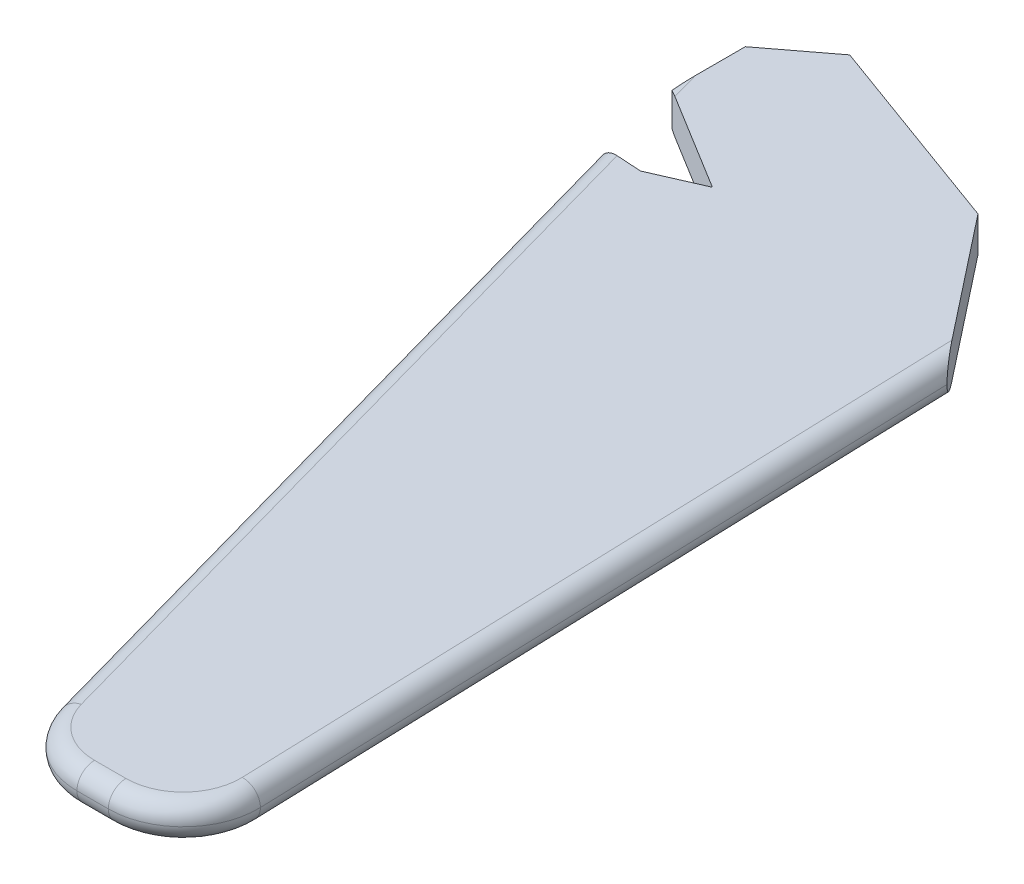
ISO-10303-21;
HEADER;
FILE_DESCRIPTION(('STEP AP214'),'2;1');
FILE_NAME('part.step','',(''),(''),'','','');
FILE_SCHEMA(('AUTOMOTIVE_DESIGN { 1 0 10303 214 1 1 1 1 }'));
ENDSEC;
DATA;
#1=APPLICATION_CONTEXT('core data for automotive mechanical design processes');
#2=APPLICATION_PROTOCOL_DEFINITION('international standard','automotive_design',2000,#1);
#3=PRODUCT_CONTEXT('',#1,'mechanical');
#4=PRODUCT('Part','Part','',(#3));
#5=PRODUCT_RELATED_PRODUCT_CATEGORY('part','',(#4));
#6=PRODUCT_DEFINITION_FORMATION('','',#4);
#7=PRODUCT_DEFINITION_CONTEXT('part definition',#1,'design');
#8=PRODUCT_DEFINITION('design','',#6,#7);
#9=PRODUCT_DEFINITION_SHAPE('','',#8);
#10=(LENGTH_UNIT() NAMED_UNIT(*) SI_UNIT(.MILLI.,.METRE.));
#11=(NAMED_UNIT(*) PLANE_ANGLE_UNIT() SI_UNIT($,.RADIAN.));
#12=(NAMED_UNIT(*) SI_UNIT($,.STERADIAN.) SOLID_ANGLE_UNIT());
#13=UNCERTAINTY_MEASURE_WITH_UNIT(LENGTH_MEASURE(1.E-05),#10,'distance_accuracy_value','');
#14=(GEOMETRIC_REPRESENTATION_CONTEXT(3) GLOBAL_UNCERTAINTY_ASSIGNED_CONTEXT((#13)) GLOBAL_UNIT_ASSIGNED_CONTEXT((#10,
#11,#12)) REPRESENTATION_CONTEXT('',''));
#15=CARTESIAN_POINT('',(0.,0.,0.));
#16=DIRECTION('',(0.,0.,1.));
#17=DIRECTION('',(1.,0.,0.));
#18=AXIS2_PLACEMENT_3D('',#15,#16,#17);
#19=CARTESIAN_POINT('',(-17.5181859795401,2.,-28.9969477945657));
#20=DIRECTION('',(0.268583597078111,0.,0.963256378842405));
#21=DIRECTION('',(0.963256378842405,0.,-0.268583597078111));
#22=AXIS2_PLACEMENT_3D('',#19,#20,#21);
#23=CYLINDRICAL_SURFACE('',#22,2.);
#24=CARTESIAN_POINT('',(-18.5412944385262,2.,-32.6662550794755));
#25=DIRECTION('',(0.523754339580232,0.,-0.851869351350825));
#26=DIRECTION('',(0.851869351350825,0.,0.523754339580232));
#27=AXIS2_PLACEMENT_3D('',#24,#25,#26);
#28=ELLIPSE('',#27,2.94162306901688,2.);
#29=CARTESIAN_POINT('',(-18.5412944385262,0.,-32.6662550794755));
#30=VERTEX_POINT('',#29);
#31=CARTESIAN_POINT('',(-19.4446987372249,0.134492396611618,-33.2216946208659));
#32=VERTEX_POINT('',#31);
#33=EDGE_CURVE('E376',#30,#32,#28,.T.);
#34=ORIENTED_EDGE('',*,*,#33,.T.);
#35=CARTESIAN_POINT('',(-19.4446987372249,2.,-35.9062517243268));
#36=DIRECTION('',(1.,0.,0.));
#37=DIRECTION('',(0.,0.,1.));
#38=AXIS2_PLACEMENT_3D('',#35,#36,#37);
#39=ELLIPSE('',#38,7.44647112391733,2.);
#40=CARTESIAN_POINT('',(-19.4446987372249,0.,-35.9062517243268));
#41=VERTEX_POINT('',#40);
#42=EDGE_CURVE('E246',#41,#32,#39,.F.);
#43=ORIENTED_EDGE('',*,*,#42,.F.);
#44=DIRECTION('',(0.268583597078111,0.,0.963256378842405));
#45=VECTOR('',#44,1.);
#46=CARTESIAN_POINT('',(7.78607381269461,0.,61.75501890006));
#47=LINE('',#46,#45);
#48=EDGE_CURVE('E229',#30,#41,#47,.F.);
#49=ORIENTED_EDGE('',*,*,#48,.F.);
#50=EDGE_LOOP('',(#34,#43,#49));
#51=FACE_BOUND('',#50,.T.);
#52=ADVANCED_FACE('F45',(#51),#23,.T.);
#53=CARTESIAN_POINT('',(7.78607381269461,2.,61.75501890006));
#54=DIRECTION('',(-0.268583597078111,0.,-0.963256378842405));
#55=DIRECTION('',(-0.963256378842405,0.,0.268583597078111));
#56=AXIS2_PLACEMENT_3D('',#53,#54,#55);
#57=CYLINDRICAL_SURFACE('',#56,2.);
#58=CARTESIAN_POINT('',(-18.5412944385262,2.,-32.6662550794755));
#59=DIRECTION('',(0.523754339580232,0.,-0.851869351350825));
#60=DIRECTION('',(-0.851869351350825,0.,-0.523754339580232));
#61=AXIS2_PLACEMENT_3D('',#58,#59,#60);
#62=ELLIPSE('',#61,2.94162306901688,2.);
#63=CARTESIAN_POINT('',(-19.4446987372249,3.86550760338838,-33.2216946208659));
#64=VERTEX_POINT('',#63);
#65=CARTESIAN_POINT('',(-18.5412944385262,4.,-32.6662550794755));
#66=VERTEX_POINT('',#65);
#67=EDGE_CURVE('E345',#64,#66,#62,.T.);
#68=ORIENTED_EDGE('',*,*,#67,.T.);
#69=DIRECTION('',(0.268583597078111,0.,0.963256378842405));
#70=VECTOR('',#69,1.);
#71=CARTESIAN_POINT('',(7.52857558402527,4.,60.8315194235293));
#72=LINE('',#71,#70);
#73=CARTESIAN_POINT('',(-19.4446987372249,4.,-35.9062517243268));
#74=VERTEX_POINT('',#73);
#75=EDGE_CURVE('E213',#74,#66,#72,.T.);
#76=ORIENTED_EDGE('',*,*,#75,.F.);
#77=CARTESIAN_POINT('',(-19.4446987372249,2.,-35.9062517243268));
#78=DIRECTION('',(1.,0.,0.));
#79=DIRECTION('',(0.,0.,-1.));
#80=AXIS2_PLACEMENT_3D('',#77,#78,#79);
#81=ELLIPSE('',#80,7.44647112391733,2.);
#82=EDGE_CURVE('E54',#64,#74,#81,.F.);
#83=ORIENTED_EDGE('',*,*,#82,.F.);
#84=EDGE_LOOP('',(#68,#76,#83));
#85=FACE_BOUND('',#84,.T.);
#86=ADVANCED_FACE('F425',(#85),#57,.T.);
#87=CARTESIAN_POINT('',(-19.4446987372249,4.,-54.4597806004095));
#88=DIRECTION('',(1.,0.,0.));
#89=DIRECTION('',(0.,0.,-1.));
#90=AXIS2_PLACEMENT_3D('',#87,#88,#89);
#91=PLANE('',#90);
#92=ORIENTED_EDGE('',*,*,#42,.T.);
#93=DIRECTION('',(0.,1.,0.));
#94=VECTOR('',#93,1.);
#95=CARTESIAN_POINT('',(-19.4446987372249,-4.001,-33.2216946208659));
#96=LINE('',#95,#94);
#97=EDGE_CURVE('E398',#32,#64,#96,.T.);
#98=ORIENTED_EDGE('',*,*,#97,.T.);
#99=ORIENTED_EDGE('',*,*,#82,.T.);
#100=DIRECTION('',(0.,0.,1.));
#101=VECTOR('',#100,1.);
#102=CARTESIAN_POINT('',(-19.4446987372249,4.,-54.4597806004095));
#103=LINE('',#102,#101);
#104=CARTESIAN_POINT('',(-19.4446987372249,4.,-41.566075464098));
#105=VERTEX_POINT('',#104);
#106=EDGE_CURVE('E204',#105,#74,#103,.T.);
#107=ORIENTED_EDGE('',*,*,#106,.F.);
#108=DIRECTION('',(0.,1.,0.));
#109=VECTOR('',#108,1.);
#110=CARTESIAN_POINT('',(-19.4446987372249,-4.001,-41.566075464098));
#111=LINE('',#110,#109);
#112=CARTESIAN_POINT('',(-19.4446987372249,0.,-41.566075464098));
#113=VERTEX_POINT('',#112);
#114=EDGE_CURVE('E186',#113,#105,#111,.T.);
#115=ORIENTED_EDGE('',*,*,#114,.F.);
#116=DIRECTION('',(0.,0.,1.));
#117=VECTOR('',#116,1.);
#118=CARTESIAN_POINT('',(-19.4446987372249,0.,-54.4597806004095));
#119=LINE('',#118,#117);
#120=EDGE_CURVE('E208',#113,#41,#119,.T.);
#121=ORIENTED_EDGE('',*,*,#120,.T.);
#122=EDGE_LOOP('',(#92,#98,#99,#107,#115,#121));
#123=FACE_BOUND('',#122,.T.);
#124=ADVANCED_FACE('F374',(#123),#91,.F.);
#125=CARTESIAN_POINT('',(17.3593068767919,4.,59.0857260425216));
#126=DIRECTION('',(0.,1.,0.));
#127=DIRECTION('',(0.,0.,1.));
#128=AXIS2_PLACEMENT_3D('',#125,#126,#127);
#129=PLANE('',#128);
#130=DIRECTION('',(0.939548448707142,0.,0.342415993394005));
#131=VECTOR('',#130,1.);
#132=CARTESIAN_POINT('',(10.2162900774194,4.,-38.3317696207473));
#133=LINE('',#132,#131);
#134=CARTESIAN_POINT('',(-12.7074777041041,4.,-46.6862772866852));
#135=VERTEX_POINT('',#134);
#136=CARTESIAN_POINT('',(10.2162900774194,4.,-38.3317696207473));
#137=VERTEX_POINT('',#136);
#138=EDGE_CURVE('E69',#135,#137,#133,.T.);
#139=ORIENTED_EDGE('',*,*,#138,.F.);
#140=DIRECTION('',(0.796167099320932,0.,-0.605076813271582));
#141=VECTOR('',#140,1.);
#142=CARTESIAN_POINT('',(-2.47901174887073,4.,-54.4597806004095));
#143=LINE('',#142,#141);
#144=EDGE_CURVE('E178',#105,#135,#143,.T.);
#145=ORIENTED_EDGE('',*,*,#144,.F.);
#146=ORIENTED_EDGE('',*,*,#106,.T.);
#147=ORIENTED_EDGE('',*,*,#75,.T.);
#148=DIRECTION('',(-0.851869351350825,0.,-0.523754339580232));
#149=VECTOR('',#148,1.);
#150=CARTESIAN_POINT('',(-19.4446987372249,4.,-33.2216946208659));
#151=LINE('',#150,#149);
#152=CARTESIAN_POINT('',(-7.48638485962827,4.,-25.8693714300831));
#153=VERTEX_POINT('',#152);
#154=EDGE_CURVE('E394',#153,#66,#151,.T.);
#155=ORIENTED_EDGE('',*,*,#154,.F.);
#156=DIRECTION('',(0.91631304449055,0.,-0.400462737962547));
#157=VECTOR('',#156,1.);
#158=CARTESIAN_POINT('',(-7.48638485962827,4.,-25.8693714300831));
#159=LINE('',#158,#157);
#160=CARTESIAN_POINT('',(-13.1676201619051,4.,-23.3864611868658));
#161=VERTEX_POINT('',#160);
#162=EDGE_CURVE('E390',#161,#153,#159,.T.);
#163=ORIENTED_EDGE('',*,*,#162,.F.);
#164=DIRECTION('',(0.998076625392882,0.,0.0619923369809254));
#165=VECTOR('',#164,1.);
#166=CARTESIAN_POINT('',(-13.1676201619051,4.,-23.3864611868658));
#167=LINE('',#166,#165);
#168=CARTESIAN_POINT('',(-16.0029242427989,4.,-23.5625670303996));
#169=VERTEX_POINT('',#168);
#170=EDGE_CURVE('E362',#169,#161,#167,.T.);
#171=ORIENTED_EDGE('',*,*,#170,.F.);
#172=CARTESIAN_POINT('',(7.52857558402527,4.,60.8315194235293));
#173=VERTEX_POINT('',#172);
#174=EDGE_CURVE('E207',#169,#173,#72,.T.);
#175=ORIENTED_EDGE('',*,*,#174,.T.);
#176=CARTESIAN_POINT('',(13.7897420465009,4.,59.0857260425216));
#177=DIRECTION('',(0.,1.,0.));
#178=DIRECTION('',(0.,0.,1.));
#179=AXIS2_PLACEMENT_3D('',#176,#177,#178);
#180=CIRCLE('',#179,6.49999999999997);
#181=CARTESIAN_POINT('',(13.7897420465009,4.,65.5857260425216));
#182=VERTEX_POINT('',#181);
#183=EDGE_CURVE('E217',#173,#182,#180,.T.);
#184=ORIENTED_EDGE('',*,*,#183,.T.);
#185=DIRECTION('',(1.,0.,0.));
#186=VECTOR('',#185,1.);
#187=CARTESIAN_POINT('',(17.3593068767919,4.,65.5857260425216));
#188=LINE('',#187,#186);
#189=CARTESIAN_POINT('',(17.3593068767919,4.,65.5857260425216));
#190=VERTEX_POINT('',#189);
#191=EDGE_CURVE('E220',#182,#190,#188,.T.);
#192=ORIENTED_EDGE('',*,*,#191,.T.);
#193=CARTESIAN_POINT('',(17.3593068767919,4.,59.0857260425216));
#194=DIRECTION('',(0.,1.,0.));
#195=DIRECTION('',(0.,0.,1.));
#196=AXIS2_PLACEMENT_3D('',#193,#194,#195);
#197=CIRCLE('',#196,6.49999999999999);
#198=CARTESIAN_POINT('',(23.8558821506884,4.,58.8747527963602));
#199=VERTEX_POINT('',#198);
#200=EDGE_CURVE('E223',#190,#199,#197,.T.);
#201=ORIENTED_EDGE('',*,*,#200,.T.);
#202=DIRECTION('',(-0.0324574224863656,0.,-0.999473119061009));
#203=VECTOR('',#202,1.);
#204=CARTESIAN_POINT('',(20.1781642634871,4.,-54.3745407755998));
#205=LINE('',#204,#203);
#206=CARTESIAN_POINT('',(21.1502296961745,4.,-24.4413792515271));
#207=VERTEX_POINT('',#206);
#208=EDGE_CURVE('E226',#199,#207,#205,.T.);
#209=ORIENTED_EDGE('',*,*,#208,.T.);
#210=DIRECTION('',(0.618522985408685,0.,0.785766706167376));
#211=VECTOR('',#210,1.);
#212=CARTESIAN_POINT('',(23.2373906514239,4.,-21.7898664900994));
#213=LINE('',#212,#211);
#214=EDGE_CURVE('E181',#137,#207,#213,.T.);
#215=ORIENTED_EDGE('',*,*,#214,.F.);
#216=EDGE_LOOP('',(#139,#145,#146,#147,#155,#163,#171,#175,#184,#192,#201,#209,#215));
#217=FACE_BOUND('',#216,.T.);
#218=ADVANCED_FACE('F176',(#217),#129,.T.);
#219=CARTESIAN_POINT('',(17.3593068767919,0.,59.0857260425216));
#220=DIRECTION('',(0.,1.,0.));
#221=DIRECTION('',(0.,0.,1.));
#222=AXIS2_PLACEMENT_3D('',#219,#220,#221);
#223=PLANE('',#222);
#224=CARTESIAN_POINT('',(-9.88106975072465,0.,-35.0336820729827));
#225=DIRECTION('',(0.,1.,0.));
#226=DIRECTION('',(0.,0.,1.));
#227=AXIS2_PLACEMENT_3D('',#224,#225,#226);
#228=CIRCLE('',#227,4.);
#229=CARTESIAN_POINT('',(-9.88106975072465,0.,-31.0336820729827));
#230=VERTEX_POINT('',#229);
#231=EDGE_CURVE('E11',#230,#230,#228,.F.);
#232=ORIENTED_EDGE('',*,*,#231,.F.);
#233=EDGE_LOOP('',(#232));
#234=FACE_BOUND('',#233,.T.);
#235=DIRECTION('',(-0.796167099320932,0.,0.605076813271582));
#236=VECTOR('',#235,1.);
#237=CARTESIAN_POINT('',(-2.47901174887073,0.,-54.4597806004095));
#238=LINE('',#237,#236);
#239=CARTESIAN_POINT('',(-12.7074777041041,0.,-46.6862772866852));
#240=VERTEX_POINT('',#239);
#241=EDGE_CURVE('E192',#240,#113,#238,.T.);
#242=ORIENTED_EDGE('',*,*,#241,.F.);
#243=DIRECTION('',(-0.939548448707142,0.,-0.342415993394005));
#244=VECTOR('',#243,1.);
#245=CARTESIAN_POINT('',(10.2162900774194,0.,-38.3317696207473));
#246=LINE('',#245,#244);
#247=CARTESIAN_POINT('',(10.2162900774194,0.,-38.3317696207473));
#248=VERTEX_POINT('',#247);
#249=EDGE_CURVE('E166',#248,#240,#246,.T.);
#250=ORIENTED_EDGE('',*,*,#249,.F.);
#251=DIRECTION('',(-0.618522985408685,0.,-0.785766706167376));
#252=VECTOR('',#251,1.);
#253=CARTESIAN_POINT('',(23.2373906514239,0.,-21.7898664900994));
#254=LINE('',#253,#252);
#255=CARTESIAN_POINT('',(21.1502296961745,0.,-24.4413792515271));
#256=VERTEX_POINT('',#255);
#257=EDGE_CURVE('E351',#256,#248,#254,.T.);
#258=ORIENTED_EDGE('',*,*,#257,.F.);
#259=DIRECTION('',(-0.0324574224863656,0.,-0.999473119061009));
#260=VECTOR('',#259,1.);
#261=CARTESIAN_POINT('',(23.8558821506884,0.,58.8747527963602));
#262=LINE('',#261,#260);
#263=CARTESIAN_POINT('',(23.8558821506884,0.,58.8747527963602));
#264=VERTEX_POINT('',#263);
#265=EDGE_CURVE('E243',#256,#264,#262,.F.);
#266=ORIENTED_EDGE('',*,*,#265,.T.);
#267=CARTESIAN_POINT('',(17.3593068767919,0.,59.0857260425216));
#268=DIRECTION('',(0.,1.,0.));
#269=DIRECTION('',(0.,0.,1.));
#270=AXIS2_PLACEMENT_3D('',#267,#268,#269);
#271=CIRCLE('',#270,6.49999999999999);
#272=CARTESIAN_POINT('',(17.3593068767919,0.,65.5857260425216));
#273=VERTEX_POINT('',#272);
#274=EDGE_CURVE('E240',#264,#273,#271,.F.);
#275=ORIENTED_EDGE('',*,*,#274,.T.);
#276=DIRECTION('',(1.,0.,0.));
#277=VECTOR('',#276,1.);
#278=CARTESIAN_POINT('',(17.3593068767918,0.,65.5857260425216));
#279=LINE('',#278,#277);
#280=CARTESIAN_POINT('',(13.7897420465009,0.,65.5857260425216));
#281=VERTEX_POINT('',#280);
#282=EDGE_CURVE('E237',#273,#281,#279,.F.);
#283=ORIENTED_EDGE('',*,*,#282,.T.);
#284=CARTESIAN_POINT('',(13.7897420465009,0.,59.0857260425216));
#285=DIRECTION('',(0.,1.,0.));
#286=DIRECTION('',(0.,0.,1.));
#287=AXIS2_PLACEMENT_3D('',#284,#285,#286);
#288=CIRCLE('',#287,6.49999999999997);
#289=CARTESIAN_POINT('',(7.52857558402527,0.,60.8315194235293));
#290=VERTEX_POINT('',#289);
#291=EDGE_CURVE('E234',#281,#290,#288,.F.);
#292=ORIENTED_EDGE('',*,*,#291,.T.);
#293=CARTESIAN_POINT('',(-16.0029242427989,0.,-23.5625670303996));
#294=VERTEX_POINT('',#293);
#295=EDGE_CURVE('E230',#290,#294,#47,.F.);
#296=ORIENTED_EDGE('',*,*,#295,.T.);
#297=DIRECTION('',(-0.998076625392882,0.,-0.0619923369809254));
#298=VECTOR('',#297,1.);
#299=CARTESIAN_POINT('',(-13.1676201619051,0.,-23.3864611868658));
#300=LINE('',#299,#298);
#301=CARTESIAN_POINT('',(-13.1676201619051,0.,-23.3864611868658));
#302=VERTEX_POINT('',#301);
#303=EDGE_CURVE('E311',#302,#294,#300,.T.);
#304=ORIENTED_EDGE('',*,*,#303,.F.);
#305=DIRECTION('',(-0.91631304449055,0.,0.400462737962547));
#306=VECTOR('',#305,1.);
#307=CARTESIAN_POINT('',(-7.48638485962827,0.,-25.8693714300831));
#308=LINE('',#307,#306);
#309=CARTESIAN_POINT('',(-7.48638485962827,0.,-25.8693714300831));
#310=VERTEX_POINT('',#309);
#311=EDGE_CURVE('E379',#310,#302,#308,.T.);
#312=ORIENTED_EDGE('',*,*,#311,.F.);
#313=DIRECTION('',(0.851869351350825,0.,0.523754339580232));
#314=VECTOR('',#313,1.);
#315=CARTESIAN_POINT('',(-19.4446987372249,0.,-33.2216946208659));
#316=LINE('',#315,#314);
#317=EDGE_CURVE('E369',#30,#310,#316,.T.);
#318=ORIENTED_EDGE('',*,*,#317,.F.);
#319=ORIENTED_EDGE('',*,*,#48,.T.);
#320=ORIENTED_EDGE('',*,*,#120,.F.);
#321=EDGE_LOOP('',(#242,#250,#258,#266,#275,#283,#292,#296,#304,#312,#318,#319,#320));
#322=FACE_BOUND('',#321,.T.);
#323=ADVANCED_FACE('F309',(#234,#322),#223,.F.);
#324=CARTESIAN_POINT('',(-16.0029242427989,2.,-23.5625670303996));
#325=DIRECTION('',(-0.0619923369809254,0.,0.998076625392882));
#326=DIRECTION('',(-0.998076625392882,0.,-0.0619923369809254));
#327=AXIS2_PLACEMENT_3D('',#324,#325,#326);
#328=ELLIPSE('',#327,2.11695420209556,2.);
#329=CARTESIAN_POINT('',(-18.1158067489377,2.,-23.6938019686691));
#330=VERTEX_POINT('',#329);
#331=EDGE_CURVE('E61',#330,#294,#328,.T.);
#332=ORIENTED_EDGE('',*,*,#331,.T.);
#333=ORIENTED_EDGE('',*,*,#295,.F.);
#334=CARTESIAN_POINT('',(7.52857558402527,2.,60.8315194235293));
#335=DIRECTION('',(0.268583597078112,0.,0.963256378842405));
#336=DIRECTION('',(0.963256378842405,0.,-0.268583597078112));
#337=AXIS2_PLACEMENT_3D('',#334,#335,#336);
#338=CIRCLE('',#337,2.);
#339=CARTESIAN_POINT('',(5.60206282634046,2.,61.3686866176855));
#340=VERTEX_POINT('',#339);
#341=EDGE_CURVE('E212',#340,#290,#338,.T.);
#342=ORIENTED_EDGE('',*,*,#341,.F.);
#343=DIRECTION('',(0.268583597078111,0.,0.963256378842405));
#344=VECTOR('',#343,1.);
#345=CARTESIAN_POINT('',(-19.4446987372249,2.,-28.4597806004095));
#346=LINE('',#345,#344);
#347=EDGE_CURVE('E295',#330,#340,#346,.T.);
#348=ORIENTED_EDGE('',*,*,#347,.F.);
#349=EDGE_LOOP('',(#332,#333,#342,#348));
#350=FACE_BOUND('',#349,.T.);
#351=ADVANCED_FACE('F47',(#350),#23,.T.);
#352=CARTESIAN_POINT('',(13.7897420465009,2.,59.0857260425216));
#353=DIRECTION('',(0.,1.,0.));
#354=DIRECTION('',(0.,0.,1.));
#355=AXIS2_PLACEMENT_3D('',#352,#353,#354);
#356=TOROIDAL_SURFACE('',#355,6.49999999999997,2.);
#357=ORIENTED_EDGE('',*,*,#341,.T.);
#358=ORIENTED_EDGE('',*,*,#291,.F.);
#359=CARTESIAN_POINT('',(13.7897420465009,2.,65.5857260425216));
#360=DIRECTION('',(1.,0.,0.));
#361=DIRECTION('',(0.,1.,0.));
#362=AXIS2_PLACEMENT_3D('',#359,#360,#361);
#363=CIRCLE('',#362,2.);
#364=CARTESIAN_POINT('',(13.7897420465009,2.,67.5857260425216));
#365=VERTEX_POINT('',#364);
#366=EDGE_CURVE('E291',#365,#281,#363,.T.);
#367=ORIENTED_EDGE('',*,*,#366,.F.);
#368=CARTESIAN_POINT('',(13.7897420465009,2.,59.0857260425216));
#369=DIRECTION('',(0.,1.,0.));
#370=DIRECTION('',(0.,0.,1.));
#371=AXIS2_PLACEMENT_3D('',#368,#369,#370);
#372=CIRCLE('',#371,8.49999999999997);
#373=EDGE_CURVE('E287',#340,#365,#372,.T.);
#374=ORIENTED_EDGE('',*,*,#373,.F.);
#375=EDGE_LOOP('',(#357,#358,#367,#374));
#376=FACE_BOUND('',#375,.T.);
#377=ADVANCED_FACE('F303',(#376),#356,.T.);
#378=EDGE_CURVE('E337',#169,#330,#328,.T.);
#379=ORIENTED_EDGE('',*,*,#378,.T.);
#380=ORIENTED_EDGE('',*,*,#347,.T.);
#381=CARTESIAN_POINT('',(7.52857558402527,2.,60.8315194235293));
#382=DIRECTION('',(0.268583597078112,0.,0.963256378842405));
#383=DIRECTION('',(0.963256378842405,0.,-0.268583597078112));
#384=AXIS2_PLACEMENT_3D('',#381,#382,#383);
#385=CIRCLE('',#384,2.);
#386=EDGE_CURVE('E283',#173,#340,#385,.T.);
#387=ORIENTED_EDGE('',*,*,#386,.F.);
#388=ORIENTED_EDGE('',*,*,#174,.F.);
#389=EDGE_LOOP('',(#379,#380,#387,#388));
#390=FACE_BOUND('',#389,.T.);
#391=ADVANCED_FACE('F336',(#390),#57,.T.);
#392=CARTESIAN_POINT('',(13.7897420465009,2.,65.5857260425216));
#393=DIRECTION('',(1.,0.,0.));
#394=DIRECTION('',(0.,0.,-1.));
#395=AXIS2_PLACEMENT_3D('',#392,#393,#394);
#396=CYLINDRICAL_SURFACE('',#395,2.);
#397=ORIENTED_EDGE('',*,*,#366,.T.);
#398=ORIENTED_EDGE('',*,*,#282,.F.);
#399=CARTESIAN_POINT('',(17.3593068767919,2.,65.5857260425216));
#400=DIRECTION('',(1.,0.,0.));
#401=DIRECTION('',(0.,1.,0.));
#402=AXIS2_PLACEMENT_3D('',#399,#400,#401);
#403=CIRCLE('',#402,2.);
#404=CARTESIAN_POINT('',(17.3593068767919,2.,67.5857260425216));
#405=VERTEX_POINT('',#404);
#406=EDGE_CURVE('E279',#405,#273,#403,.T.);
#407=ORIENTED_EDGE('',*,*,#406,.F.);
#408=DIRECTION('',(1.,0.,0.));
#409=VECTOR('',#408,1.);
#410=CARTESIAN_POINT('',(13.7897420465009,2.,67.5857260425216));
#411=LINE('',#410,#409);
#412=EDGE_CURVE('E275',#365,#405,#411,.T.);
#413=ORIENTED_EDGE('',*,*,#412,.F.);
#414=EDGE_LOOP('',(#397,#398,#407,#413));
#415=FACE_BOUND('',#414,.T.);
#416=ADVANCED_FACE('F315',(#415),#396,.T.);
#417=CARTESIAN_POINT('',(13.7897420465009,2.,59.0857260425216));
#418=DIRECTION('',(0.,1.,0.));
#419=DIRECTION('',(0.,0.,1.));
#420=AXIS2_PLACEMENT_3D('',#417,#418,#419);
#421=TOROIDAL_SURFACE('',#420,6.49999999999997,2.);
#422=ORIENTED_EDGE('',*,*,#386,.T.);
#423=ORIENTED_EDGE('',*,*,#373,.T.);
#424=CARTESIAN_POINT('',(13.7897420465009,2.,65.5857260425216));
#425=DIRECTION('',(1.,0.,0.));
#426=DIRECTION('',(0.,0.,-1.));
#427=AXIS2_PLACEMENT_3D('',#424,#425,#426);
#428=CIRCLE('',#427,2.);
#429=EDGE_CURVE('E271',#182,#365,#428,.T.);
#430=ORIENTED_EDGE('',*,*,#429,.F.);
#431=ORIENTED_EDGE('',*,*,#183,.F.);
#432=EDGE_LOOP('',(#422,#423,#430,#431));
#433=FACE_BOUND('',#432,.T.);
#434=ADVANCED_FACE('F332',(#433),#421,.T.);
#435=CARTESIAN_POINT('',(17.3593068767919,2.,59.0857260425216));
#436=DIRECTION('',(0.,1.,0.));
#437=DIRECTION('',(0.,0.,1.));
#438=AXIS2_PLACEMENT_3D('',#435,#436,#437);
#439=TOROIDAL_SURFACE('',#438,6.49999999999999,2.);
#440=ORIENTED_EDGE('',*,*,#406,.T.);
#441=ORIENTED_EDGE('',*,*,#274,.F.);
#442=CARTESIAN_POINT('',(23.8558821506884,2.,58.8747527963602));
#443=DIRECTION('',(-0.0324574224863684,0.,-0.999473119061009));
#444=DIRECTION('',(-0.999473119061009,0.,0.0324574224863684));
#445=AXIS2_PLACEMENT_3D('',#442,#443,#444);
#446=CIRCLE('',#445,2.);
#447=CARTESIAN_POINT('',(25.8548283888104,2.,58.8098379513875));
#448=VERTEX_POINT('',#447);
#449=EDGE_CURVE('E267',#448,#264,#446,.T.);
#450=ORIENTED_EDGE('',*,*,#449,.F.);
#451=CARTESIAN_POINT('',(17.3593068767919,2.,59.0857260425216));
#452=DIRECTION('',(0.,1.,0.));
#453=DIRECTION('',(0.,0.,1.));
#454=AXIS2_PLACEMENT_3D('',#451,#452,#453);
#455=CIRCLE('',#454,8.49999999999999);
#456=EDGE_CURVE('E263',#405,#448,#455,.T.);
#457=ORIENTED_EDGE('',*,*,#456,.F.);
#458=EDGE_LOOP('',(#440,#441,#450,#457));
#459=FACE_BOUND('',#458,.T.);
#460=ADVANCED_FACE('F319',(#459),#439,.T.);
#461=CARTESIAN_POINT('',(17.3593068767918,2.,65.5857260425216));
#462=DIRECTION('',(-1.,0.,0.));
#463=DIRECTION('',(0.,0.,1.));
#464=AXIS2_PLACEMENT_3D('',#461,#462,#463);
#465=CYLINDRICAL_SURFACE('',#464,2.);
#466=ORIENTED_EDGE('',*,*,#429,.T.);
#467=ORIENTED_EDGE('',*,*,#412,.T.);
#468=CARTESIAN_POINT('',(17.3593068767919,2.,65.5857260425216));
#469=DIRECTION('',(1.,0.,0.));
#470=DIRECTION('',(0.,0.,-1.));
#471=AXIS2_PLACEMENT_3D('',#468,#469,#470);
#472=CIRCLE('',#471,2.);
#473=EDGE_CURVE('E259',#190,#405,#472,.T.);
#474=ORIENTED_EDGE('',*,*,#473,.F.);
#475=ORIENTED_EDGE('',*,*,#191,.F.);
#476=EDGE_LOOP('',(#466,#467,#474,#475));
#477=FACE_BOUND('',#476,.T.);
#478=ADVANCED_FACE('F328',(#477),#465,.T.);
#479=CARTESIAN_POINT('',(23.8558821506884,2.,58.8747527963602));
#480=DIRECTION('',(-0.0324574224863656,0.,-0.999473119061009));
#481=DIRECTION('',(-0.999473119061009,0.,0.0324574224863656));
#482=AXIS2_PLACEMENT_3D('',#479,#480,#481);
#483=CYLINDRICAL_SURFACE('',#482,2.);
#484=CARTESIAN_POINT('',(21.1502296961745,2.,-24.4413792515271));
#485=DIRECTION('',(-0.785766706167376,0.,0.618522985408685));
#486=DIRECTION('',(0.618522985408685,0.,0.785766706167376));
#487=AXIS2_PLACEMENT_3D('',#484,#485,#486);
#488=ELLIPSE('',#487,3.37442747397739,2.);
#489=CARTESIAN_POINT('',(23.2373906514241,2.,-21.7898664900992));
#490=VERTEX_POINT('',#489);
#491=EDGE_CURVE('E188',#256,#490,#488,.T.);
#492=ORIENTED_EDGE('',*,*,#491,.T.);
#493=DIRECTION('',(-0.0324574224863656,0.,-0.999473119061009));
#494=VECTOR('',#493,1.);
#495=CARTESIAN_POINT('',(25.8548283888104,2.,58.8098379513875));
#496=LINE('',#495,#494);
#497=EDGE_CURVE('E255',#448,#490,#496,.T.);
#498=ORIENTED_EDGE('',*,*,#497,.F.);
#499=ORIENTED_EDGE('',*,*,#449,.T.);
#500=ORIENTED_EDGE('',*,*,#265,.F.);
#501=EDGE_LOOP('',(#492,#498,#499,#500));
#502=FACE_BOUND('',#501,.T.);
#503=ADVANCED_FACE('F453',(#502),#483,.T.);
#504=CARTESIAN_POINT('',(17.3593068767919,2.,59.0857260425216));
#505=DIRECTION('',(0.,1.,0.));
#506=DIRECTION('',(0.,0.,1.));
#507=AXIS2_PLACEMENT_3D('',#504,#505,#506);
#508=TOROIDAL_SURFACE('',#507,6.49999999999999,2.);
#509=ORIENTED_EDGE('',*,*,#473,.T.);
#510=ORIENTED_EDGE('',*,*,#456,.T.);
#511=CARTESIAN_POINT('',(23.8558821506884,2.,58.8747527963602));
#512=DIRECTION('',(-0.032457422486365,0.,-0.999473119061009));
#513=DIRECTION('',(-0.999473119061009,0.,0.032457422486365));
#514=AXIS2_PLACEMENT_3D('',#511,#512,#513);
#515=CIRCLE('',#514,2.);
#516=EDGE_CURVE('E203',#199,#448,#515,.T.);
#517=ORIENTED_EDGE('',*,*,#516,.F.);
#518=ORIENTED_EDGE('',*,*,#200,.F.);
#519=EDGE_LOOP('',(#509,#510,#517,#518));
#520=FACE_BOUND('',#519,.T.);
#521=ADVANCED_FACE('F325',(#520),#508,.T.);
#522=CARTESIAN_POINT('',(23.8558821506884,2.,58.8747527963602));
#523=DIRECTION('',(0.0324574224863656,0.,0.999473119061009));
#524=DIRECTION('',(0.999473119061009,0.,-0.0324574224863656));
#525=AXIS2_PLACEMENT_3D('',#522,#523,#524);
#526=CYLINDRICAL_SURFACE('',#525,2.);
#527=EDGE_CURVE('E195',#490,#207,#488,.T.);
#528=ORIENTED_EDGE('',*,*,#527,.T.);
#529=ORIENTED_EDGE('',*,*,#208,.F.);
#530=ORIENTED_EDGE('',*,*,#516,.T.);
#531=ORIENTED_EDGE('',*,*,#497,.T.);
#532=EDGE_LOOP('',(#528,#529,#530,#531));
#533=FACE_BOUND('',#532,.T.);
#534=ADVANCED_FACE('F360',(#533),#526,.T.);
#535=CARTESIAN_POINT('',(-9.88106975072465,-4.,-35.0336820729827));
#536=DIRECTION('',(0.,1.,0.));
#537=DIRECTION('',(0.,0.,1.));
#538=AXIS2_PLACEMENT_3D('',#535,#536,#537);
#539=CYLINDRICAL_SURFACE('',#538,4.);
#540=CARTESIAN_POINT('',(-9.88106975072465,-4.,-35.0336820729827));
#541=DIRECTION('',(0.,-1.,0.));
#542=DIRECTION('',(0.,0.,-1.));
#543=AXIS2_PLACEMENT_3D('',#540,#541,#542);
#544=CIRCLE('',#543,4.);
#545=CARTESIAN_POINT('',(-9.88106975072465,-4.,-39.0336820729827));
#546=VERTEX_POINT('',#545);
#547=EDGE_CURVE('E199',#546,#546,#544,.T.);
#548=ORIENTED_EDGE('',*,*,#547,.F.);
#549=EDGE_LOOP('',(#548));
#550=FACE_BOUND('',#549,.T.);
#551=ORIENTED_EDGE('',*,*,#231,.T.);
#552=EDGE_LOOP('',(#551));
#553=FACE_BOUND('',#552,.T.);
#554=ADVANCED_FACE('F450',(#550,#553),#539,.T.);
#555=CARTESIAN_POINT('',(-9.88106975072465,-4.,-35.0336820729827));
#556=DIRECTION('',(0.,-1.,0.));
#557=DIRECTION('',(0.,0.,-1.));
#558=AXIS2_PLACEMENT_3D('',#555,#556,#557);
#559=PLANE('',#558);
#560=ORIENTED_EDGE('',*,*,#547,.T.);
#561=EDGE_LOOP('',(#560));
#562=FACE_BOUND('',#561,.T.);
#563=ADVANCED_FACE('F475',(#562),#559,.T.);
#564=CARTESIAN_POINT('',(-2.47901174887073,-4.001,-54.4597806004095));
#565=DIRECTION('',(0.605076813271582,0.,0.796167099320932));
#566=DIRECTION('',(0.796167099320932,0.,-0.605076813271582));
#567=AXIS2_PLACEMENT_3D('',#564,#565,#566);
#568=PLANE('',#567);
#569=ORIENTED_EDGE('',*,*,#144,.T.);
#570=DIRECTION('',(0.,1.,0.));
#571=VECTOR('',#570,1.);
#572=CARTESIAN_POINT('',(-12.7074777041041,-4.001,-46.6862772866852));
#573=LINE('',#572,#571);
#574=EDGE_CURVE('E163',#240,#135,#573,.T.);
#575=ORIENTED_EDGE('',*,*,#574,.F.);
#576=ORIENTED_EDGE('',*,*,#241,.T.);
#577=ORIENTED_EDGE('',*,*,#114,.T.);
#578=EDGE_LOOP('',(#569,#575,#576,#577));
#579=FACE_BOUND('',#578,.T.);
#580=ADVANCED_FACE('F184',(#579),#568,.F.);
#581=CARTESIAN_POINT('',(23.2373906514239,-4.001,-21.7898664900994));
#582=DIRECTION('',(-0.785766706167376,0.,0.618522985408685));
#583=DIRECTION('',(0.618522985408685,0.,0.785766706167376));
#584=AXIS2_PLACEMENT_3D('',#581,#582,#583);
#585=PLANE('',#584);
#586=ORIENTED_EDGE('',*,*,#257,.T.);
#587=DIRECTION('',(0.,-1.,0.));
#588=VECTOR('',#587,1.);
#589=CARTESIAN_POINT('',(10.2162900774194,-4.001,-38.3317696207473));
#590=LINE('',#589,#588);
#591=EDGE_CURVE('E171',#137,#248,#590,.T.);
#592=ORIENTED_EDGE('',*,*,#591,.F.);
#593=ORIENTED_EDGE('',*,*,#214,.T.);
#594=ORIENTED_EDGE('',*,*,#527,.F.);
#595=ORIENTED_EDGE('',*,*,#491,.F.);
#596=EDGE_LOOP('',(#586,#592,#593,#594,#595));
#597=FACE_BOUND('',#596,.T.);
#598=ADVANCED_FACE('F421',(#597),#585,.F.);
#599=CARTESIAN_POINT('',(10.2162900774194,-4.001,-38.3317696207473));
#600=DIRECTION('',(-0.342415993394005,0.,0.939548448707142));
#601=DIRECTION('',(0.939548448707142,0.,0.342415993394005));
#602=AXIS2_PLACEMENT_3D('',#599,#600,#601);
#603=PLANE('',#602);
#604=ORIENTED_EDGE('',*,*,#249,.T.);
#605=ORIENTED_EDGE('',*,*,#574,.T.);
#606=ORIENTED_EDGE('',*,*,#138,.T.);
#607=ORIENTED_EDGE('',*,*,#591,.T.);
#608=EDGE_LOOP('',(#604,#605,#606,#607));
#609=FACE_BOUND('',#608,.T.);
#610=ADVANCED_FACE('F164',(#609),#603,.F.);
#611=CARTESIAN_POINT('',(-19.4446987372249,-4.001,-33.2216946208659));
#612=DIRECTION('',(0.523754339580232,0.,-0.851869351350825));
#613=DIRECTION('',(-0.851869351350825,0.,-0.523754339580232));
#614=AXIS2_PLACEMENT_3D('',#611,#612,#613);
#615=PLANE('',#614);
#616=ORIENTED_EDGE('',*,*,#317,.T.);
#617=DIRECTION('',(0.,1.,0.));
#618=VECTOR('',#617,1.);
#619=CARTESIAN_POINT('',(-7.48638485962827,-4.001,-25.8693714300831));
#620=LINE('',#619,#618);
#621=EDGE_CURVE('E401',#310,#153,#620,.T.);
#622=ORIENTED_EDGE('',*,*,#621,.T.);
#623=ORIENTED_EDGE('',*,*,#154,.T.);
#624=ORIENTED_EDGE('',*,*,#67,.F.);
#625=ORIENTED_EDGE('',*,*,#97,.F.);
#626=ORIENTED_EDGE('',*,*,#33,.F.);
#627=EDGE_LOOP('',(#616,#622,#623,#624,#625,#626));
#628=FACE_BOUND('',#627,.T.);
#629=ADVANCED_FACE('F413',(#628),#615,.F.);
#630=CARTESIAN_POINT('',(-7.48638485962827,-4.001,-25.8693714300831));
#631=DIRECTION('',(0.400462737962547,0.,0.91631304449055));
#632=DIRECTION('',(0.91631304449055,0.,-0.400462737962547));
#633=AXIS2_PLACEMENT_3D('',#630,#631,#632);
#634=PLANE('',#633);
#635=ORIENTED_EDGE('',*,*,#311,.T.);
#636=DIRECTION('',(0.,1.,0.));
#637=VECTOR('',#636,1.);
#638=CARTESIAN_POINT('',(-13.1676201619051,-4.001,-23.3864611868658));
#639=LINE('',#638,#637);
#640=EDGE_CURVE('E397',#302,#161,#639,.T.);
#641=ORIENTED_EDGE('',*,*,#640,.T.);
#642=ORIENTED_EDGE('',*,*,#162,.T.);
#643=ORIENTED_EDGE('',*,*,#621,.F.);
#644=EDGE_LOOP('',(#635,#641,#642,#643));
#645=FACE_BOUND('',#644,.T.);
#646=ADVANCED_FACE('F411',(#645),#634,.F.);
#647=CARTESIAN_POINT('',(-13.1676201619051,-4.001,-23.3864611868658));
#648=DIRECTION('',(-0.0619923369809254,0.,0.998076625392882));
#649=DIRECTION('',(0.998076625392882,0.,0.0619923369809254));
#650=AXIS2_PLACEMENT_3D('',#647,#648,#649);
#651=PLANE('',#650);
#652=ORIENTED_EDGE('',*,*,#303,.T.);
#653=ORIENTED_EDGE('',*,*,#331,.F.);
#654=ORIENTED_EDGE('',*,*,#378,.F.);
#655=ORIENTED_EDGE('',*,*,#170,.T.);
#656=ORIENTED_EDGE('',*,*,#640,.F.);
#657=EDGE_LOOP('',(#652,#653,#654,#655,#656));
#658=FACE_BOUND('',#657,.T.);
#659=ADVANCED_FACE('F409',(#658),#651,.F.);
#660=CLOSED_SHELL('',(#52,#86,#124,#218,#323,#351,#377,#391,#416,#434,#460,#478,#503,#521,#534,
#554,#563,#580,#598,#610,#629,#646,#659));
#661=MANIFOLD_SOLID_BREP('B2',#660);
#662=ADVANCED_BREP_SHAPE_REPRESENTATION('',(#18,#661),#14);
#663=SHAPE_DEFINITION_REPRESENTATION(#9,#662);
ENDSEC;
END-ISO-10303-21;
